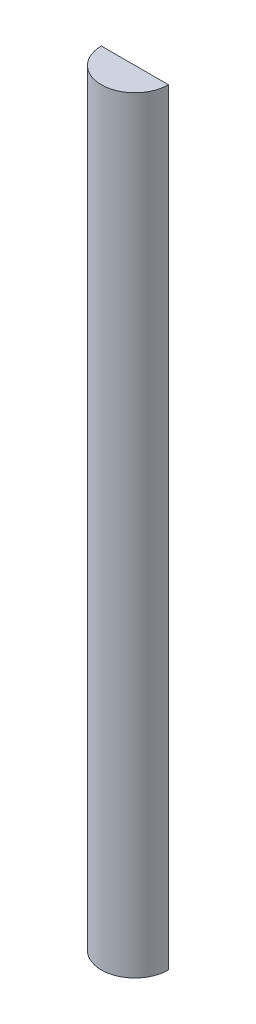
ISO-10303-21;
HEADER;
FILE_DESCRIPTION(('STEP AP214'),'2;1');
FILE_NAME('part.step','',(''),(''),'','','');
FILE_SCHEMA(('AUTOMOTIVE_DESIGN { 1 0 10303 214 1 1 1 1 }'));
ENDSEC;
DATA;
#1=APPLICATION_CONTEXT('core data for automotive mechanical design processes');
#2=APPLICATION_PROTOCOL_DEFINITION('international standard','automotive_design',2000,#1);
#3=PRODUCT_CONTEXT('',#1,'mechanical');
#4=PRODUCT('Part','Part','',(#3));
#5=PRODUCT_RELATED_PRODUCT_CATEGORY('part','',(#4));
#6=PRODUCT_DEFINITION_FORMATION('','',#4);
#7=PRODUCT_DEFINITION_CONTEXT('part definition',#1,'design');
#8=PRODUCT_DEFINITION('design','',#6,#7);
#9=PRODUCT_DEFINITION_SHAPE('','',#8);
#10=(LENGTH_UNIT() NAMED_UNIT(*) SI_UNIT(.MILLI.,.METRE.));
#11=(NAMED_UNIT(*) PLANE_ANGLE_UNIT() SI_UNIT($,.RADIAN.));
#12=(NAMED_UNIT(*) SI_UNIT($,.STERADIAN.) SOLID_ANGLE_UNIT());
#13=UNCERTAINTY_MEASURE_WITH_UNIT(LENGTH_MEASURE(1.E-05),#10,'distance_accuracy_value','');
#14=(GEOMETRIC_REPRESENTATION_CONTEXT(3) GLOBAL_UNCERTAINTY_ASSIGNED_CONTEXT((#13)) GLOBAL_UNIT_ASSIGNED_CONTEXT((#10,
#11,#12)) REPRESENTATION_CONTEXT('',''));
#15=CARTESIAN_POINT('',(0.,0.,0.));
#16=DIRECTION('',(0.,0.,1.));
#17=DIRECTION('',(1.,0.,0.));
#18=AXIS2_PLACEMENT_3D('',#15,#16,#17);
#19=CARTESIAN_POINT('',(0.,0.,0.));
#20=DIRECTION('',(0.,1.,0.));
#21=DIRECTION('',(0.,0.,1.));
#22=AXIS2_PLACEMENT_3D('',#19,#20,#21);
#23=PLANE('',#22);
#24=CARTESIAN_POINT('',(0.,0.,0.));
#25=DIRECTION('',(0.,1.,0.));
#26=DIRECTION('',(0.,0.,1.));
#27=AXIS2_PLACEMENT_3D('',#24,#25,#26);
#28=CIRCLE('',#27,6.35);
#29=CARTESIAN_POINT('',(-6.35,0.,0.));
#30=VERTEX_POINT('',#29);
#31=CARTESIAN_POINT('',(6.35,0.,0.));
#32=VERTEX_POINT('',#31);
#33=EDGE_CURVE('E11',#30,#32,#28,.T.);
#34=ORIENTED_EDGE('',*,*,#33,.F.);
#35=DIRECTION('',(-1.,0.,0.));
#36=VECTOR('',#35,1.);
#37=CARTESIAN_POINT('',(0.,0.,0.));
#38=LINE('',#37,#36);
#39=EDGE_CURVE('E60',#32,#30,#38,.T.);
#40=ORIENTED_EDGE('',*,*,#39,.F.);
#41=EDGE_LOOP('',(#34,#40));
#42=FACE_BOUND('',#41,.T.);
#43=ADVANCED_FACE('F36',(#42),#23,.F.);
#44=CARTESIAN_POINT('',(0.,140.431855581948,0.));
#45=DIRECTION('',(0.,1.,0.));
#46=DIRECTION('',(0.,0.,1.));
#47=AXIS2_PLACEMENT_3D('',#44,#45,#46);
#48=CYLINDRICAL_SURFACE('',#47,6.35);
#49=CARTESIAN_POINT('',(0.,145.,0.));
#50=DIRECTION('',(0.,1.,0.));
#51=DIRECTION('',(0.,0.,1.));
#52=AXIS2_PLACEMENT_3D('',#49,#50,#51);
#53=CIRCLE('',#52,6.35000000000001);
#54=CARTESIAN_POINT('',(-6.35000000000001,145.,0.));
#55=VERTEX_POINT('',#54);
#56=CARTESIAN_POINT('',(6.35000000000001,145.,0.));
#57=VERTEX_POINT('',#56);
#58=EDGE_CURVE('E43',#55,#57,#53,.T.);
#59=ORIENTED_EDGE('',*,*,#58,.F.);
#60=DIRECTION('',(0.,1.,0.));
#61=VECTOR('',#60,1.);
#62=CARTESIAN_POINT('',(-6.35,0.,0.));
#63=LINE('',#62,#61);
#64=EDGE_CURVE('E63',#30,#55,#63,.T.);
#65=ORIENTED_EDGE('',*,*,#64,.F.);
#66=ORIENTED_EDGE('',*,*,#33,.T.);
#67=DIRECTION('',(0.,1.,0.));
#68=VECTOR('',#67,1.);
#69=CARTESIAN_POINT('',(6.35,0.,0.));
#70=LINE('',#69,#68);
#71=EDGE_CURVE('E64',#32,#57,#70,.T.);
#72=ORIENTED_EDGE('',*,*,#71,.T.);
#73=EDGE_LOOP('',(#59,#65,#66,#72));
#74=FACE_BOUND('',#73,.T.);
#75=ADVANCED_FACE('F66',(#74),#48,.T.);
#76=CARTESIAN_POINT('',(-6.35000000000001,145.,0.));
#77=DIRECTION('',(0.,-1.,0.));
#78=DIRECTION('',(0.,0.,-1.));
#79=AXIS2_PLACEMENT_3D('',#76,#77,#78);
#80=PLANE('',#79);
#81=DIRECTION('',(1.,0.,0.));
#82=VECTOR('',#81,1.);
#83=CARTESIAN_POINT('',(-6.35000000000001,145.,0.));
#84=LINE('',#83,#82);
#85=EDGE_CURVE('E69',#55,#57,#84,.T.);
#86=ORIENTED_EDGE('',*,*,#85,.F.);
#87=ORIENTED_EDGE('',*,*,#58,.T.);
#88=EDGE_LOOP('',(#86,#87));
#89=FACE_BOUND('',#88,.T.);
#90=ADVANCED_FACE('F74',(#89),#80,.F.);
#91=CARTESIAN_POINT('',(0.,0.,0.));
#92=DIRECTION('',(0.,0.,-1.));
#93=DIRECTION('',(-1.,0.,0.));
#94=AXIS2_PLACEMENT_3D('',#91,#92,#93);
#95=PLANE('',#94);
#96=ORIENTED_EDGE('',*,*,#85,.T.);
#97=ORIENTED_EDGE('',*,*,#71,.F.);
#98=ORIENTED_EDGE('',*,*,#39,.T.);
#99=ORIENTED_EDGE('',*,*,#64,.T.);
#100=EDGE_LOOP('',(#96,#97,#98,#99));
#101=FACE_BOUND('',#100,.T.);
#102=ADVANCED_FACE('F67',(#101),#95,.T.);
#103=CLOSED_SHELL('',(#43,#75,#90,#102));
#104=MANIFOLD_SOLID_BREP('B2',#103);
#105=ADVANCED_BREP_SHAPE_REPRESENTATION('',(#18,#104),#14);
#106=SHAPE_DEFINITION_REPRESENTATION(#9,#105);
ENDSEC;
END-ISO-10303-21;
